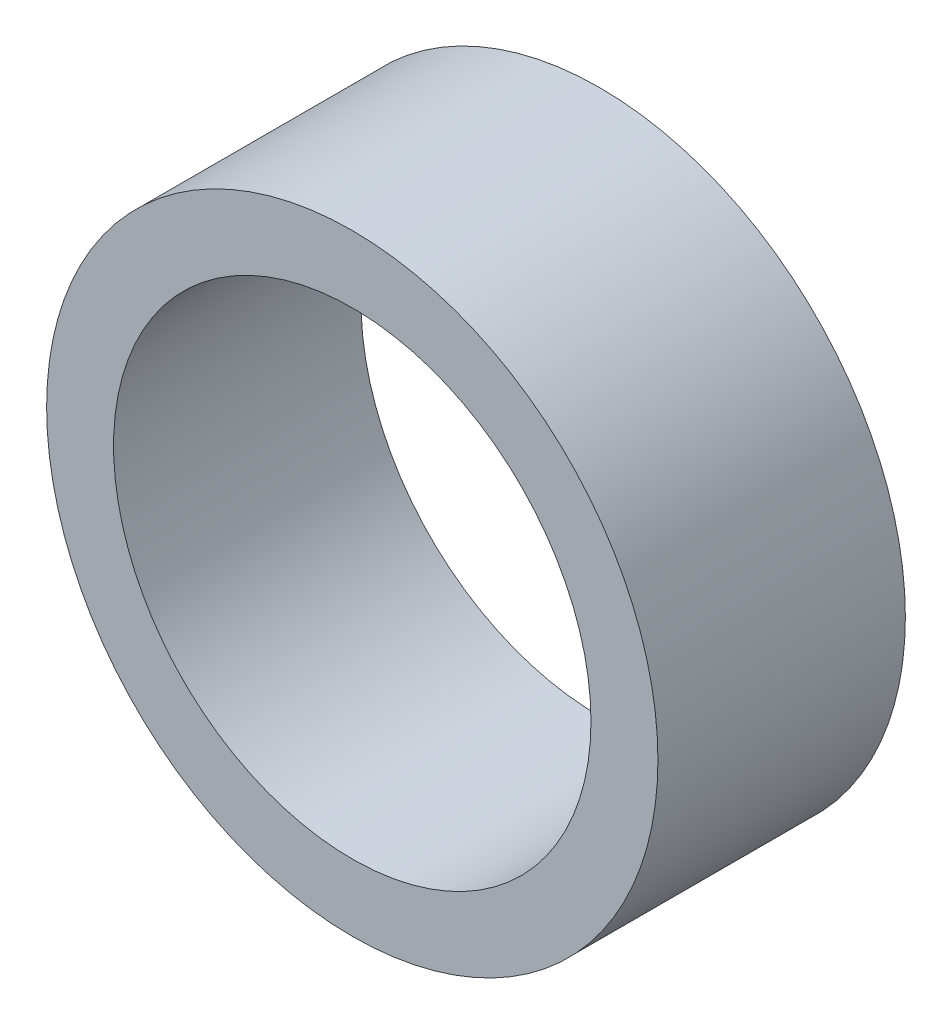
ISO-10303-21;
HEADER;
FILE_DESCRIPTION(('STEP AP214'),'2;1');
FILE_NAME('part.step','',(''),(''),'','','');
FILE_SCHEMA(('AUTOMOTIVE_DESIGN { 1 0 10303 214 1 1 1 1 }'));
ENDSEC;
DATA;
#1=APPLICATION_CONTEXT('core data for automotive mechanical design processes');
#2=APPLICATION_PROTOCOL_DEFINITION('international standard','automotive_design',2000,#1);
#3=PRODUCT_CONTEXT('',#1,'mechanical');
#4=PRODUCT('Part','Part','',(#3));
#5=PRODUCT_RELATED_PRODUCT_CATEGORY('part','',(#4));
#6=PRODUCT_DEFINITION_FORMATION('','',#4);
#7=PRODUCT_DEFINITION_CONTEXT('part definition',#1,'design');
#8=PRODUCT_DEFINITION('design','',#6,#7);
#9=PRODUCT_DEFINITION_SHAPE('','',#8);
#10=(LENGTH_UNIT() NAMED_UNIT(*) SI_UNIT(.MILLI.,.METRE.));
#11=(NAMED_UNIT(*) PLANE_ANGLE_UNIT() SI_UNIT($,.RADIAN.));
#12=(NAMED_UNIT(*) SI_UNIT($,.STERADIAN.) SOLID_ANGLE_UNIT());
#13=UNCERTAINTY_MEASURE_WITH_UNIT(LENGTH_MEASURE(1.E-05),#10,'distance_accuracy_value','');
#14=(GEOMETRIC_REPRESENTATION_CONTEXT(3) GLOBAL_UNCERTAINTY_ASSIGNED_CONTEXT((#13)) GLOBAL_UNIT_ASSIGNED_CONTEXT((#10,
#11,#12)) REPRESENTATION_CONTEXT('',''));
#15=CARTESIAN_POINT('',(0.,0.,0.));
#16=DIRECTION('',(0.,0.,1.));
#17=DIRECTION('',(1.,0.,0.));
#18=AXIS2_PLACEMENT_3D('',#15,#16,#17);
#19=CARTESIAN_POINT('',(0.,0.,8.5));
#20=DIRECTION('',(0.,0.,1.));
#21=DIRECTION('',(1.,0.,0.));
#22=AXIS2_PLACEMENT_3D('',#19,#20,#21);
#23=PLANE('',#22);
#24=CARTESIAN_POINT('',(0.,0.,8.5));
#25=DIRECTION('',(0.,0.,1.));
#26=DIRECTION('',(1.,0.,0.));
#27=AXIS2_PLACEMENT_3D('',#24,#25,#26);
#28=CIRCLE('',#27,10.5);
#29=CARTESIAN_POINT('',(10.5,0.,8.5));
#30=VERTEX_POINT('',#29);
#31=EDGE_CURVE('E10',#30,#30,#28,.T.);
#32=ORIENTED_EDGE('',*,*,#31,.T.);
#33=EDGE_LOOP('',(#32));
#34=FACE_BOUND('',#33,.T.);
#35=CARTESIAN_POINT('',(0.,0.,8.5));
#36=DIRECTION('',(0.,0.,1.));
#37=DIRECTION('',(1.,0.,0.));
#38=AXIS2_PLACEMENT_3D('',#35,#36,#37);
#39=CIRCLE('',#38,8.2);
#40=CARTESIAN_POINT('',(8.2,0.,8.5));
#41=VERTEX_POINT('',#40);
#42=EDGE_CURVE('E48',#41,#41,#39,.T.);
#43=ORIENTED_EDGE('',*,*,#42,.F.);
#44=EDGE_LOOP('',(#43));
#45=FACE_BOUND('',#44,.T.);
#46=ADVANCED_FACE('F37',(#34,#45),#23,.T.);
#47=CARTESIAN_POINT('',(0.,0.,0.));
#48=DIRECTION('',(0.,0.,1.));
#49=DIRECTION('',(1.,0.,0.));
#50=AXIS2_PLACEMENT_3D('',#47,#48,#49);
#51=PLANE('',#50);
#52=CARTESIAN_POINT('',(0.,0.,0.));
#53=DIRECTION('',(0.,0.,1.));
#54=DIRECTION('',(1.,0.,0.));
#55=AXIS2_PLACEMENT_3D('',#52,#53,#54);
#56=CIRCLE('',#55,10.5);
#57=CARTESIAN_POINT('',(10.5,0.,0.));
#58=VERTEX_POINT('',#57);
#59=EDGE_CURVE('E41',#58,#58,#56,.T.);
#60=ORIENTED_EDGE('',*,*,#59,.F.);
#61=EDGE_LOOP('',(#60));
#62=FACE_BOUND('',#61,.T.);
#63=CARTESIAN_POINT('',(0.,0.,0.));
#64=DIRECTION('',(0.,0.,1.));
#65=DIRECTION('',(1.,0.,0.));
#66=AXIS2_PLACEMENT_3D('',#63,#64,#65);
#67=CIRCLE('',#66,8.2);
#68=CARTESIAN_POINT('',(8.2,0.,0.));
#69=VERTEX_POINT('',#68);
#70=EDGE_CURVE('E50',#69,#69,#67,.T.);
#71=ORIENTED_EDGE('',*,*,#70,.T.);
#72=EDGE_LOOP('',(#71));
#73=FACE_BOUND('',#72,.T.);
#74=ADVANCED_FACE('F60',(#62,#73),#51,.F.);
#75=CARTESIAN_POINT('',(0.,0.,8.5));
#76=DIRECTION('',(0.,0.,-1.));
#77=DIRECTION('',(-1.,0.,0.));
#78=AXIS2_PLACEMENT_3D('',#75,#76,#77);
#79=CYLINDRICAL_SURFACE('',#78,10.5);
#80=ORIENTED_EDGE('',*,*,#31,.F.);
#81=EDGE_LOOP('',(#80));
#82=FACE_BOUND('',#81,.T.);
#83=ORIENTED_EDGE('',*,*,#59,.T.);
#84=EDGE_LOOP('',(#83));
#85=FACE_BOUND('',#84,.T.);
#86=ADVANCED_FACE('F39',(#82,#85),#79,.T.);
#87=CARTESIAN_POINT('',(0.,0.,8.5));
#88=DIRECTION('',(0.,0.,-1.));
#89=DIRECTION('',(-1.,0.,0.));
#90=AXIS2_PLACEMENT_3D('',#87,#88,#89);
#91=CYLINDRICAL_SURFACE('',#90,8.2);
#92=ORIENTED_EDGE('',*,*,#42,.T.);
#93=EDGE_LOOP('',(#92));
#94=FACE_BOUND('',#93,.T.);
#95=ORIENTED_EDGE('',*,*,#70,.F.);
#96=EDGE_LOOP('',(#95));
#97=FACE_BOUND('',#96,.T.);
#98=ADVANCED_FACE('F56',(#94,#97),#91,.F.);
#99=CLOSED_SHELL('',(#46,#74,#86,#98));
#100=MANIFOLD_SOLID_BREP('B2',#99);
#101=ADVANCED_BREP_SHAPE_REPRESENTATION('',(#18,#100),#14);
#102=SHAPE_DEFINITION_REPRESENTATION(#9,#101);
ENDSEC;
END-ISO-10303-21;
